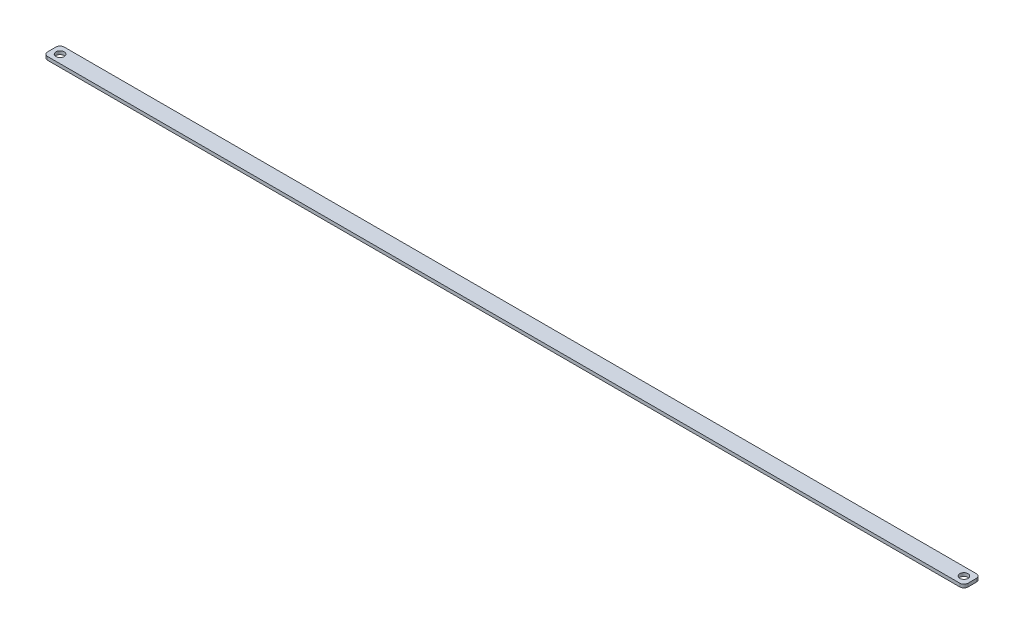
ISO-10303-21;
HEADER;
FILE_DESCRIPTION(('STEP AP214'),'2;1');
FILE_NAME('part.step','',(''),(''),'','','');
FILE_SCHEMA(('AUTOMOTIVE_DESIGN { 1 0 10303 214 1 1 1 1 }'));
ENDSEC;
DATA;
#1=APPLICATION_CONTEXT('core data for automotive mechanical design processes');
#2=APPLICATION_PROTOCOL_DEFINITION('international standard','automotive_design',2000,#1);
#3=PRODUCT_CONTEXT('',#1,'mechanical');
#4=PRODUCT('Part','Part','',(#3));
#5=PRODUCT_RELATED_PRODUCT_CATEGORY('part','',(#4));
#6=PRODUCT_DEFINITION_FORMATION('','',#4);
#7=PRODUCT_DEFINITION_CONTEXT('part definition',#1,'design');
#8=PRODUCT_DEFINITION('design','',#6,#7);
#9=PRODUCT_DEFINITION_SHAPE('','',#8);
#10=(LENGTH_UNIT() NAMED_UNIT(*) SI_UNIT(.MILLI.,.METRE.));
#11=(NAMED_UNIT(*) PLANE_ANGLE_UNIT() SI_UNIT($,.RADIAN.));
#12=(NAMED_UNIT(*) SI_UNIT($,.STERADIAN.) SOLID_ANGLE_UNIT());
#13=UNCERTAINTY_MEASURE_WITH_UNIT(LENGTH_MEASURE(1.E-05),#10,'distance_accuracy_value','');
#14=(GEOMETRIC_REPRESENTATION_CONTEXT(3) GLOBAL_UNCERTAINTY_ASSIGNED_CONTEXT((#13)) GLOBAL_UNIT_ASSIGNED_CONTEXT((#10,
#11,#12)) REPRESENTATION_CONTEXT('',''));
#15=CARTESIAN_POINT('',(0.,0.,0.));
#16=DIRECTION('',(0.,0.,1.));
#17=DIRECTION('',(1.,0.,0.));
#18=AXIS2_PLACEMENT_3D('',#15,#16,#17);
#19=CARTESIAN_POINT('',(305.13404581374,2.,-5.));
#20=DIRECTION('',(0.,-1.,0.));
#21=DIRECTION('',(0.,0.,-1.));
#22=AXIS2_PLACEMENT_3D('',#19,#20,#21);
#23=CYLINDRICAL_SURFACE('',#22,2.5);
#24=CARTESIAN_POINT('',(305.13404581374,0.,-5.));
#25=DIRECTION('',(0.,1.,0.));
#26=DIRECTION('',(0.,0.,1.));
#27=AXIS2_PLACEMENT_3D('',#24,#25,#26);
#28=CIRCLE('',#27,2.5);
#29=CARTESIAN_POINT('',(305.13404581374,0.,-2.5));
#30=VERTEX_POINT('',#29);
#31=EDGE_CURVE('E220',#30,#30,#28,.T.);
#32=ORIENTED_EDGE('',*,*,#31,.F.);
#33=EDGE_LOOP('',(#32));
#34=FACE_BOUND('',#33,.T.);
#35=CARTESIAN_POINT('',(305.13404581374,2.,-5.));
#36=DIRECTION('',(0.,1.,0.));
#37=DIRECTION('',(0.,0.,1.));
#38=AXIS2_PLACEMENT_3D('',#35,#36,#37);
#39=CIRCLE('',#38,2.5);
#40=CARTESIAN_POINT('',(305.13404581374,2.,-2.5));
#41=VERTEX_POINT('',#40);
#42=EDGE_CURVE('E13',#41,#41,#39,.T.);
#43=ORIENTED_EDGE('',*,*,#42,.T.);
#44=EDGE_LOOP('',(#43));
#45=FACE_BOUND('',#44,.T.);
#46=ADVANCED_FACE('F93',(#34,#45),#23,.F.);
#47=CARTESIAN_POINT('',(-242.86595418626,2.,-5.));
#48=DIRECTION('',(0.,-1.,0.));
#49=DIRECTION('',(0.,0.,-1.));
#50=AXIS2_PLACEMENT_3D('',#47,#48,#49);
#51=CYLINDRICAL_SURFACE('',#50,2.5);
#52=CARTESIAN_POINT('',(-242.86595418626,0.,-5.));
#53=DIRECTION('',(0.,1.,0.));
#54=DIRECTION('',(0.,0.,1.));
#55=AXIS2_PLACEMENT_3D('',#52,#53,#54);
#56=CIRCLE('',#55,2.5);
#57=CARTESIAN_POINT('',(-242.86595418626,0.,-2.5));
#58=VERTEX_POINT('',#57);
#59=EDGE_CURVE('E233',#58,#58,#56,.T.);
#60=ORIENTED_EDGE('',*,*,#59,.F.);
#61=EDGE_LOOP('',(#60));
#62=FACE_BOUND('',#61,.T.);
#63=CARTESIAN_POINT('',(-242.86595418626,2.,-5.));
#64=DIRECTION('',(0.,1.,0.));
#65=DIRECTION('',(0.,0.,1.));
#66=AXIS2_PLACEMENT_3D('',#63,#64,#65);
#67=CIRCLE('',#66,2.5);
#68=CARTESIAN_POINT('',(-242.86595418626,2.,-2.5));
#69=VERTEX_POINT('',#68);
#70=EDGE_CURVE('E103',#69,#69,#67,.T.);
#71=ORIENTED_EDGE('',*,*,#70,.T.);
#72=EDGE_LOOP('',(#71));
#73=FACE_BOUND('',#72,.T.);
#74=ADVANCED_FACE('F254',(#62,#73),#51,.F.);
#75=CARTESIAN_POINT('',(47.5,2.,-2.5));
#76=DIRECTION('',(0.,1.,0.));
#77=DIRECTION('',(0.,0.,1.));
#78=AXIS2_PLACEMENT_3D('',#75,#76,#77);
#79=PLANE('',#78);
#80=DIRECTION('',(1.,0.,0.));
#81=VECTOR('',#80,1.);
#82=CARTESIAN_POINT('',(-245.36595418626,2.,0.));
#83=LINE('',#82,#81);
#84=CARTESIAN_POINT('',(-245.36595418626,2.,0.));
#85=VERTEX_POINT('',#84);
#86=CARTESIAN_POINT('',(307.63404581374,2.,0.));
#87=VERTEX_POINT('',#86);
#88=EDGE_CURVE('E156',#85,#87,#83,.T.);
#89=ORIENTED_EDGE('',*,*,#88,.T.);
#90=CARTESIAN_POINT('',(307.63404581374,2.,-2.5));
#91=DIRECTION('',(0.,1.,0.));
#92=DIRECTION('',(0.,0.,1.));
#93=AXIS2_PLACEMENT_3D('',#90,#91,#92);
#94=CIRCLE('',#93,2.5);
#95=CARTESIAN_POINT('',(310.13404581374,2.,-2.50000000000002));
#96=VERTEX_POINT('',#95);
#97=EDGE_CURVE('E162',#87,#96,#94,.T.);
#98=ORIENTED_EDGE('',*,*,#97,.T.);
#99=DIRECTION('',(0.,0.,-1.));
#100=VECTOR('',#99,1.);
#101=CARTESIAN_POINT('',(310.13404581374,2.,-2.50000000000002));
#102=LINE('',#101,#100);
#103=CARTESIAN_POINT('',(310.13404581374,2.,-7.49999999999998));
#104=VERTEX_POINT('',#103);
#105=EDGE_CURVE('E184',#96,#104,#102,.T.);
#106=ORIENTED_EDGE('',*,*,#105,.T.);
#107=CARTESIAN_POINT('',(307.63404581374,2.,-7.5));
#108=DIRECTION('',(0.,1.,0.));
#109=DIRECTION('',(0.,0.,-1.));
#110=AXIS2_PLACEMENT_3D('',#107,#108,#109);
#111=CIRCLE('',#110,2.5);
#112=CARTESIAN_POINT('',(307.63404581374,2.,-10.));
#113=VERTEX_POINT('',#112);
#114=EDGE_CURVE('E188',#104,#113,#111,.T.);
#115=ORIENTED_EDGE('',*,*,#114,.T.);
#116=DIRECTION('',(-1.,0.,0.));
#117=VECTOR('',#116,1.);
#118=CARTESIAN_POINT('',(262.63404581374,2.,-10.));
#119=LINE('',#118,#117);
#120=CARTESIAN_POINT('',(-245.36595418626,2.,-10.));
#121=VERTEX_POINT('',#120);
#122=EDGE_CURVE('E242',#113,#121,#119,.T.);
#123=ORIENTED_EDGE('',*,*,#122,.T.);
#124=CARTESIAN_POINT('',(-245.36595418626,2.,-7.5));
#125=DIRECTION('',(0.,1.,0.));
#126=DIRECTION('',(0.,0.,-1.));
#127=AXIS2_PLACEMENT_3D('',#124,#125,#126);
#128=CIRCLE('',#127,2.5);
#129=CARTESIAN_POINT('',(-247.86595418626,2.,-7.49999999999998));
#130=VERTEX_POINT('',#129);
#131=EDGE_CURVE('E168',#121,#130,#128,.T.);
#132=ORIENTED_EDGE('',*,*,#131,.T.);
#133=DIRECTION('',(0.,0.,1.));
#134=VECTOR('',#133,1.);
#135=CARTESIAN_POINT('',(-247.86595418626,2.,-2.50000000000002));
#136=LINE('',#135,#134);
#137=CARTESIAN_POINT('',(-247.86595418626,2.,-2.50000000000002));
#138=VERTEX_POINT('',#137);
#139=EDGE_CURVE('E186',#130,#138,#136,.T.);
#140=ORIENTED_EDGE('',*,*,#139,.T.);
#141=CARTESIAN_POINT('',(-245.36595418626,2.,-2.5));
#142=DIRECTION('',(0.,1.,0.));
#143=DIRECTION('',(0.,0.,-1.));
#144=AXIS2_PLACEMENT_3D('',#141,#142,#143);
#145=CIRCLE('',#144,2.5);
#146=EDGE_CURVE('E165',#138,#85,#145,.T.);
#147=ORIENTED_EDGE('',*,*,#146,.T.);
#148=EDGE_LOOP('',(#89,#98,#106,#115,#123,#132,#140,#147));
#149=FACE_BOUND('',#148,.T.);
#150=ORIENTED_EDGE('',*,*,#42,.F.);
#151=EDGE_LOOP('',(#150));
#152=FACE_BOUND('',#151,.T.);
#153=ORIENTED_EDGE('',*,*,#70,.F.);
#154=EDGE_LOOP('',(#153));
#155=FACE_BOUND('',#154,.T.);
#156=ADVANCED_FACE('F158',(#149,#152,#155),#79,.T.);
#157=CARTESIAN_POINT('',(307.63404581374,0.,-2.5));
#158=DIRECTION('',(0.,1.,0.));
#159=DIRECTION('',(0.,0.,1.));
#160=AXIS2_PLACEMENT_3D('',#157,#158,#159);
#161=PLANE('',#160);
#162=ORIENTED_EDGE('',*,*,#31,.T.);
#163=EDGE_LOOP('',(#162));
#164=FACE_BOUND('',#163,.T.);
#165=CARTESIAN_POINT('',(307.63404581374,0.,-2.5));
#166=DIRECTION('',(0.,1.,0.));
#167=DIRECTION('',(0.,0.,1.));
#168=AXIS2_PLACEMENT_3D('',#165,#166,#167);
#169=CIRCLE('',#168,2.5);
#170=CARTESIAN_POINT('',(307.63404581374,0.,0.));
#171=VERTEX_POINT('',#170);
#172=CARTESIAN_POINT('',(310.13404581374,0.,-2.50000000000002));
#173=VERTEX_POINT('',#172);
#174=EDGE_CURVE('E177',#171,#173,#169,.T.);
#175=ORIENTED_EDGE('',*,*,#174,.F.);
#176=DIRECTION('',(1.,0.,0.));
#177=VECTOR('',#176,1.);
#178=CARTESIAN_POINT('',(-245.36595418626,0.,0.));
#179=LINE('',#178,#177);
#180=CARTESIAN_POINT('',(-245.36595418626,0.,0.));
#181=VERTEX_POINT('',#180);
#182=EDGE_CURVE('E173',#181,#171,#179,.T.);
#183=ORIENTED_EDGE('',*,*,#182,.F.);
#184=CARTESIAN_POINT('',(-245.36595418626,0.,-2.5));
#185=DIRECTION('',(0.,1.,0.));
#186=DIRECTION('',(0.,0.,-1.));
#187=AXIS2_PLACEMENT_3D('',#184,#185,#186);
#188=CIRCLE('',#187,2.5);
#189=CARTESIAN_POINT('',(-247.86595418626,0.,-2.50000000000002));
#190=VERTEX_POINT('',#189);
#191=EDGE_CURVE('E199',#190,#181,#188,.T.);
#192=ORIENTED_EDGE('',*,*,#191,.F.);
#193=DIRECTION('',(0.,0.,1.));
#194=VECTOR('',#193,1.);
#195=CARTESIAN_POINT('',(-247.86595418626,0.,-2.50000000000002));
#196=LINE('',#195,#194);
#197=CARTESIAN_POINT('',(-247.86595418626,0.,-7.49999999999998));
#198=VERTEX_POINT('',#197);
#199=EDGE_CURVE('E206',#198,#190,#196,.T.);
#200=ORIENTED_EDGE('',*,*,#199,.F.);
#201=CARTESIAN_POINT('',(-245.36595418626,0.,-7.5));
#202=DIRECTION('',(0.,1.,0.));
#203=DIRECTION('',(0.,0.,-1.));
#204=AXIS2_PLACEMENT_3D('',#201,#202,#203);
#205=CIRCLE('',#204,2.5);
#206=CARTESIAN_POINT('',(-245.36595418626,0.,-10.));
#207=VERTEX_POINT('',#206);
#208=EDGE_CURVE('E212',#207,#198,#205,.T.);
#209=ORIENTED_EDGE('',*,*,#208,.F.);
#210=DIRECTION('',(-1.,0.,0.));
#211=VECTOR('',#210,1.);
#212=CARTESIAN_POINT('',(262.63404581374,0.,-10.));
#213=LINE('',#212,#211);
#214=CARTESIAN_POINT('',(307.63404581374,0.,-10.));
#215=VERTEX_POINT('',#214);
#216=EDGE_CURVE('E218',#215,#207,#213,.T.);
#217=ORIENTED_EDGE('',*,*,#216,.F.);
#218=CARTESIAN_POINT('',(307.63404581374,0.,-7.5));
#219=DIRECTION('',(0.,1.,0.));
#220=DIRECTION('',(0.,0.,-1.));
#221=AXIS2_PLACEMENT_3D('',#218,#219,#220);
#222=CIRCLE('',#221,2.5);
#223=CARTESIAN_POINT('',(310.13404581374,0.,-7.49999999999998));
#224=VERTEX_POINT('',#223);
#225=EDGE_CURVE('E223',#224,#215,#222,.T.);
#226=ORIENTED_EDGE('',*,*,#225,.F.);
#227=DIRECTION('',(0.,0.,-1.));
#228=VECTOR('',#227,1.);
#229=CARTESIAN_POINT('',(310.13404581374,0.,-2.50000000000002));
#230=LINE('',#229,#228);
#231=EDGE_CURVE('E178',#173,#224,#230,.T.);
#232=ORIENTED_EDGE('',*,*,#231,.F.);
#233=EDGE_LOOP('',(#175,#183,#192,#200,#209,#217,#226,#232));
#234=FACE_BOUND('',#233,.T.);
#235=ORIENTED_EDGE('',*,*,#59,.T.);
#236=EDGE_LOOP('',(#235));
#237=FACE_BOUND('',#236,.T.);
#238=ADVANCED_FACE('F249',(#164,#234,#237),#161,.F.);
#239=CARTESIAN_POINT('',(262.63404581374,2.,-10.));
#240=DIRECTION('',(0.,0.,1.));
#241=DIRECTION('',(1.,0.,0.));
#242=AXIS2_PLACEMENT_3D('',#239,#240,#241);
#243=PLANE('',#242);
#244=ORIENTED_EDGE('',*,*,#216,.T.);
#245=DIRECTION('',(0.,-1.,0.));
#246=VECTOR('',#245,1.);
#247=CARTESIAN_POINT('',(-245.36595418626,2.,-10.));
#248=LINE('',#247,#246);
#249=EDGE_CURVE('E209',#121,#207,#248,.T.);
#250=ORIENTED_EDGE('',*,*,#249,.F.);
#251=ORIENTED_EDGE('',*,*,#122,.F.);
#252=DIRECTION('',(0.,-1.,0.));
#253=VECTOR('',#252,1.);
#254=CARTESIAN_POINT('',(307.63404581374,2.,-10.));
#255=LINE('',#254,#253);
#256=EDGE_CURVE('E112',#113,#215,#255,.T.);
#257=ORIENTED_EDGE('',*,*,#256,.T.);
#258=EDGE_LOOP('',(#244,#250,#251,#257));
#259=FACE_BOUND('',#258,.T.);
#260=ADVANCED_FACE('F271',(#259),#243,.F.);
#261=CARTESIAN_POINT('',(262.63404581374,2.,0.));
#262=DIRECTION('',(0.,0.,-1.));
#263=DIRECTION('',(-1.,0.,0.));
#264=AXIS2_PLACEMENT_3D('',#261,#262,#263);
#265=PLANE('',#264);
#266=DIRECTION('',(0.,-1.,0.));
#267=VECTOR('',#266,1.);
#268=CARTESIAN_POINT('',(307.63404581374,2.,0.));
#269=LINE('',#268,#267);
#270=EDGE_CURVE('E171',#87,#171,#269,.T.);
#271=ORIENTED_EDGE('',*,*,#270,.F.);
#272=ORIENTED_EDGE('',*,*,#88,.F.);
#273=DIRECTION('',(0.,-1.,0.));
#274=VECTOR('',#273,1.);
#275=CARTESIAN_POINT('',(-245.36595418626,2.,0.));
#276=LINE('',#275,#274);
#277=EDGE_CURVE('E196',#85,#181,#276,.T.);
#278=ORIENTED_EDGE('',*,*,#277,.T.);
#279=ORIENTED_EDGE('',*,*,#182,.T.);
#280=EDGE_LOOP('',(#271,#272,#278,#279));
#281=FACE_BOUND('',#280,.T.);
#282=ADVANCED_FACE('F172',(#281),#265,.F.);
#283=CARTESIAN_POINT('',(307.63404581374,2.,-2.5));
#284=DIRECTION('',(0.,-1.,0.));
#285=DIRECTION('',(0.,0.,-1.));
#286=AXIS2_PLACEMENT_3D('',#283,#284,#285);
#287=CYLINDRICAL_SURFACE('',#286,2.5);
#288=ORIENTED_EDGE('',*,*,#174,.T.);
#289=DIRECTION('',(0.,-1.,0.));
#290=VECTOR('',#289,1.);
#291=CARTESIAN_POINT('',(310.13404581374,2.,-2.50000000000002));
#292=LINE('',#291,#290);
#293=EDGE_CURVE('E182',#96,#173,#292,.T.);
#294=ORIENTED_EDGE('',*,*,#293,.F.);
#295=ORIENTED_EDGE('',*,*,#97,.F.);
#296=ORIENTED_EDGE('',*,*,#270,.T.);
#297=EDGE_LOOP('',(#288,#294,#295,#296));
#298=FACE_BOUND('',#297,.T.);
#299=ADVANCED_FACE('F180',(#298),#287,.T.);
#300=CARTESIAN_POINT('',(310.13404581374,2.,-2.50000000000002));
#301=DIRECTION('',(-1.,0.,0.));
#302=DIRECTION('',(0.,0.,1.));
#303=AXIS2_PLACEMENT_3D('',#300,#301,#302);
#304=PLANE('',#303);
#305=ORIENTED_EDGE('',*,*,#231,.T.);
#306=DIRECTION('',(0.,-1.,0.));
#307=VECTOR('',#306,1.);
#308=CARTESIAN_POINT('',(310.13404581374,2.,-7.49999999999998));
#309=LINE('',#308,#307);
#310=EDGE_CURVE('E215',#104,#224,#309,.T.);
#311=ORIENTED_EDGE('',*,*,#310,.F.);
#312=ORIENTED_EDGE('',*,*,#105,.F.);
#313=ORIENTED_EDGE('',*,*,#293,.T.);
#314=EDGE_LOOP('',(#305,#311,#312,#313));
#315=FACE_BOUND('',#314,.T.);
#316=ADVANCED_FACE('F278',(#315),#304,.F.);
#317=CARTESIAN_POINT('',(307.63404581374,2.,-7.5));
#318=DIRECTION('',(0.,-1.,0.));
#319=DIRECTION('',(0.,0.,-1.));
#320=AXIS2_PLACEMENT_3D('',#317,#318,#319);
#321=CYLINDRICAL_SURFACE('',#320,2.5);
#322=ORIENTED_EDGE('',*,*,#225,.T.);
#323=ORIENTED_EDGE('',*,*,#256,.F.);
#324=ORIENTED_EDGE('',*,*,#114,.F.);
#325=ORIENTED_EDGE('',*,*,#310,.T.);
#326=EDGE_LOOP('',(#322,#323,#324,#325));
#327=FACE_BOUND('',#326,.T.);
#328=ADVANCED_FACE('F281',(#327),#321,.T.);
#329=CARTESIAN_POINT('',(-245.36595418626,2.,-7.5));
#330=DIRECTION('',(0.,-1.,0.));
#331=DIRECTION('',(0.,0.,-1.));
#332=AXIS2_PLACEMENT_3D('',#329,#330,#331);
#333=CYLINDRICAL_SURFACE('',#332,2.5);
#334=ORIENTED_EDGE('',*,*,#208,.T.);
#335=DIRECTION('',(0.,-1.,0.));
#336=VECTOR('',#335,1.);
#337=CARTESIAN_POINT('',(-247.86595418626,2.,-7.49999999999998));
#338=LINE('',#337,#336);
#339=EDGE_CURVE('E202',#130,#198,#338,.T.);
#340=ORIENTED_EDGE('',*,*,#339,.F.);
#341=ORIENTED_EDGE('',*,*,#131,.F.);
#342=ORIENTED_EDGE('',*,*,#249,.T.);
#343=EDGE_LOOP('',(#334,#340,#341,#342));
#344=FACE_BOUND('',#343,.T.);
#345=ADVANCED_FACE('F285',(#344),#333,.T.);
#346=CARTESIAN_POINT('',(-247.86595418626,2.,-2.50000000000002));
#347=DIRECTION('',(1.,0.,0.));
#348=DIRECTION('',(0.,0.,-1.));
#349=AXIS2_PLACEMENT_3D('',#346,#347,#348);
#350=PLANE('',#349);
#351=ORIENTED_EDGE('',*,*,#199,.T.);
#352=DIRECTION('',(0.,-1.,0.));
#353=VECTOR('',#352,1.);
#354=CARTESIAN_POINT('',(-247.86595418626,2.,-2.50000000000002));
#355=LINE('',#354,#353);
#356=EDGE_CURVE('E203',#138,#190,#355,.T.);
#357=ORIENTED_EDGE('',*,*,#356,.F.);
#358=ORIENTED_EDGE('',*,*,#139,.F.);
#359=ORIENTED_EDGE('',*,*,#339,.T.);
#360=EDGE_LOOP('',(#351,#357,#358,#359));
#361=FACE_BOUND('',#360,.T.);
#362=ADVANCED_FACE('F288',(#361),#350,.F.);
#363=CARTESIAN_POINT('',(-245.36595418626,2.,-2.5));
#364=DIRECTION('',(0.,-1.,0.));
#365=DIRECTION('',(0.,0.,-1.));
#366=AXIS2_PLACEMENT_3D('',#363,#364,#365);
#367=CYLINDRICAL_SURFACE('',#366,2.5);
#368=ORIENTED_EDGE('',*,*,#191,.T.);
#369=ORIENTED_EDGE('',*,*,#277,.F.);
#370=ORIENTED_EDGE('',*,*,#146,.F.);
#371=ORIENTED_EDGE('',*,*,#356,.T.);
#372=EDGE_LOOP('',(#368,#369,#370,#371));
#373=FACE_BOUND('',#372,.T.);
#374=ADVANCED_FACE('F95',(#373),#367,.T.);
#375=CLOSED_SHELL('',(#46,#74,#156,#238,#260,#282,#299,#316,#328,#345,#362,#374));
#376=MANIFOLD_SOLID_BREP('B2',#375);
#377=ADVANCED_BREP_SHAPE_REPRESENTATION('',(#18,#376),#14);
#378=SHAPE_DEFINITION_REPRESENTATION(#9,#377);
ENDSEC;
END-ISO-10303-21;
